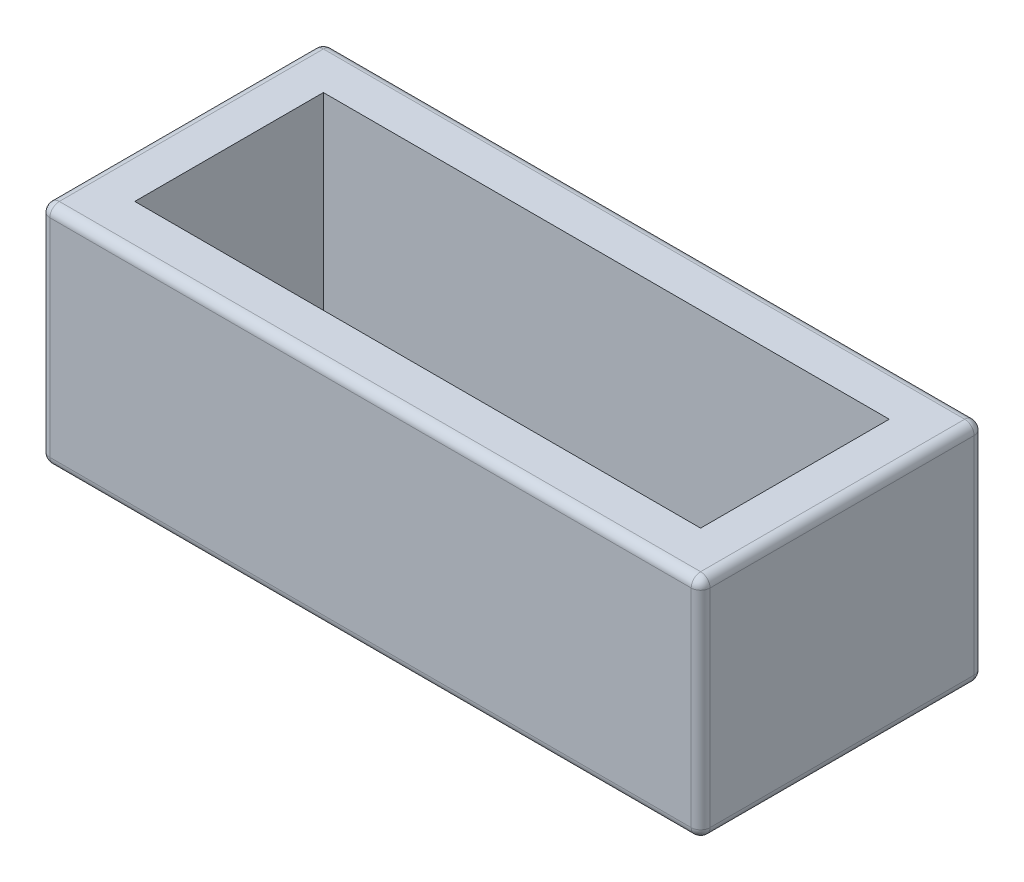
ISO-10303-21;
HEADER;
FILE_DESCRIPTION(('STEP AP214'),'2;1');
FILE_NAME('part.step','',(''),(''),'','','');
FILE_SCHEMA(('AUTOMOTIVE_DESIGN { 1 0 10303 214 1 1 1 1 }'));
ENDSEC;
DATA;
#1=APPLICATION_CONTEXT('core data for automotive mechanical design processes');
#2=APPLICATION_PROTOCOL_DEFINITION('international standard','automotive_design',2000,#1);
#3=PRODUCT_CONTEXT('',#1,'mechanical');
#4=PRODUCT('Part','Part','',(#3));
#5=PRODUCT_RELATED_PRODUCT_CATEGORY('part','',(#4));
#6=PRODUCT_DEFINITION_FORMATION('','',#4);
#7=PRODUCT_DEFINITION_CONTEXT('part definition',#1,'design');
#8=PRODUCT_DEFINITION('design','',#6,#7);
#9=PRODUCT_DEFINITION_SHAPE('','',#8);
#10=(LENGTH_UNIT() NAMED_UNIT(*) SI_UNIT(.MILLI.,.METRE.));
#11=(NAMED_UNIT(*) PLANE_ANGLE_UNIT() SI_UNIT($,.RADIAN.));
#12=(NAMED_UNIT(*) SI_UNIT($,.STERADIAN.) SOLID_ANGLE_UNIT());
#13=UNCERTAINTY_MEASURE_WITH_UNIT(LENGTH_MEASURE(1.E-05),#10,'distance_accuracy_value','');
#14=(GEOMETRIC_REPRESENTATION_CONTEXT(3) GLOBAL_UNCERTAINTY_ASSIGNED_CONTEXT((#13)) GLOBAL_UNIT_ASSIGNED_CONTEXT((#10,
#11,#12)) REPRESENTATION_CONTEXT('',''));
#15=CARTESIAN_POINT('',(0.,0.,0.));
#16=DIRECTION('',(0.,0.,1.));
#17=DIRECTION('',(1.,0.,0.));
#18=AXIS2_PLACEMENT_3D('',#15,#16,#17);
#19=CARTESIAN_POINT('',(0.,12.,0.));
#20=DIRECTION('',(0.,-1.,0.));
#21=DIRECTION('',(0.,0.,-1.));
#22=AXIS2_PLACEMENT_3D('',#19,#20,#21);
#23=PLANE('',#22);
#24=DIRECTION('',(0.,0.,-1.));
#25=VECTOR('',#24,1.);
#26=CARTESIAN_POINT('',(34.5,12.,0.));
#27=LINE('',#26,#25);
#28=CARTESIAN_POINT('',(34.5,12.,-0.5));
#29=VERTEX_POINT('',#28);
#30=CARTESIAN_POINT('',(34.5,12.,-14.5));
#31=VERTEX_POINT('',#30);
#32=EDGE_CURVE('E194',#29,#31,#27,.T.);
#33=ORIENTED_EDGE('',*,*,#32,.T.);
#34=DIRECTION('',(-1.,0.,0.));
#35=VECTOR('',#34,1.);
#36=CARTESIAN_POINT('',(0.,12.,-14.5));
#37=LINE('',#36,#35);
#38=CARTESIAN_POINT('',(0.5,12.,-14.5));
#39=VERTEX_POINT('',#38);
#40=EDGE_CURVE('E198',#31,#39,#37,.T.);
#41=ORIENTED_EDGE('',*,*,#40,.T.);
#42=DIRECTION('',(0.,0.,1.));
#43=VECTOR('',#42,1.);
#44=CARTESIAN_POINT('',(0.5,12.,0.));
#45=LINE('',#44,#43);
#46=CARTESIAN_POINT('',(0.5,12.,-0.5));
#47=VERTEX_POINT('',#46);
#48=EDGE_CURVE('E196',#39,#47,#45,.T.);
#49=ORIENTED_EDGE('',*,*,#48,.T.);
#50=DIRECTION('',(1.,0.,0.));
#51=VECTOR('',#50,1.);
#52=CARTESIAN_POINT('',(0.,12.,-0.5));
#53=LINE('',#52,#51);
#54=EDGE_CURVE('E160',#47,#29,#53,.T.);
#55=ORIENTED_EDGE('',*,*,#54,.T.);
#56=EDGE_LOOP('',(#33,#41,#49,#55));
#57=FACE_BOUND('',#56,.T.);
#58=DIRECTION('',(0.,0.,1.));
#59=VECTOR('',#58,1.);
#60=CARTESIAN_POINT('',(2.5,12.,0.));
#61=LINE('',#60,#59);
#62=CARTESIAN_POINT('',(2.5,12.,-12.5));
#63=VERTEX_POINT('',#62);
#64=CARTESIAN_POINT('',(2.5,12.,-2.5));
#65=VERTEX_POINT('',#64);
#66=EDGE_CURVE('E157',#63,#65,#61,.T.);
#67=ORIENTED_EDGE('',*,*,#66,.F.);
#68=DIRECTION('',(-1.,0.,0.));
#69=VECTOR('',#68,1.);
#70=CARTESIAN_POINT('',(0.,12.,-12.5));
#71=LINE('',#70,#69);
#72=CARTESIAN_POINT('',(32.5,12.,-12.5));
#73=VERTEX_POINT('',#72);
#74=EDGE_CURVE('E183',#73,#63,#71,.T.);
#75=ORIENTED_EDGE('',*,*,#74,.F.);
#76=DIRECTION('',(0.,0.,-1.));
#77=VECTOR('',#76,1.);
#78=CARTESIAN_POINT('',(32.5,12.,0.));
#79=LINE('',#78,#77);
#80=CARTESIAN_POINT('',(32.5,12.,-2.5));
#81=VERTEX_POINT('',#80);
#82=EDGE_CURVE('E189',#81,#73,#79,.T.);
#83=ORIENTED_EDGE('',*,*,#82,.F.);
#84=DIRECTION('',(1.,0.,0.));
#85=VECTOR('',#84,1.);
#86=CARTESIAN_POINT('',(0.,12.,-2.5));
#87=LINE('',#86,#85);
#88=EDGE_CURVE('E187',#65,#81,#87,.T.);
#89=ORIENTED_EDGE('',*,*,#88,.F.);
#90=EDGE_LOOP('',(#67,#75,#83,#89));
#91=FACE_BOUND('',#90,.T.);
#92=ADVANCED_FACE('F37',(#57,#91),#23,.F.);
#93=CARTESIAN_POINT('',(0.,12.,0.));
#94=DIRECTION('',(1.,0.,0.));
#95=DIRECTION('',(0.,0.,-1.));
#96=AXIS2_PLACEMENT_3D('',#93,#94,#95);
#97=PLANE('',#96);
#98=DIRECTION('',(0.,0.,1.));
#99=VECTOR('',#98,1.);
#100=CARTESIAN_POINT('',(0.,11.5,0.));
#101=LINE('',#100,#99);
#102=CARTESIAN_POINT('',(0.,11.5,-0.5));
#103=VERTEX_POINT('',#102);
#104=CARTESIAN_POINT('',(0.,11.5,-14.5));
#105=VERTEX_POINT('',#104);
#106=EDGE_CURVE('E214',#103,#105,#101,.F.);
#107=ORIENTED_EDGE('',*,*,#106,.T.);
#108=DIRECTION('',(0.,-1.,0.));
#109=VECTOR('',#108,1.);
#110=CARTESIAN_POINT('',(0.,12.,-14.5));
#111=LINE('',#110,#109);
#112=CARTESIAN_POINT('',(0.,0.5,-14.5));
#113=VERTEX_POINT('',#112);
#114=EDGE_CURVE('E216',#105,#113,#111,.T.);
#115=ORIENTED_EDGE('',*,*,#114,.T.);
#116=DIRECTION('',(0.,0.,1.));
#117=VECTOR('',#116,1.);
#118=CARTESIAN_POINT('',(0.,0.5,0.));
#119=LINE('',#118,#117);
#120=CARTESIAN_POINT('',(0.,0.5,-0.5));
#121=VERTEX_POINT('',#120);
#122=EDGE_CURVE('E210',#113,#121,#119,.T.);
#123=ORIENTED_EDGE('',*,*,#122,.T.);
#124=DIRECTION('',(0.,-1.,0.));
#125=VECTOR('',#124,1.);
#126=CARTESIAN_POINT('',(0.,12.,-0.5));
#127=LINE('',#126,#125);
#128=EDGE_CURVE('E212',#121,#103,#127,.F.);
#129=ORIENTED_EDGE('',*,*,#128,.T.);
#130=EDGE_LOOP('',(#107,#115,#123,#129));
#131=FACE_BOUND('',#130,.T.);
#132=ADVANCED_FACE('F393',(#131),#97,.F.);
#133=CARTESIAN_POINT('',(0.,12.,0.));
#134=DIRECTION('',(0.,0.,-1.));
#135=DIRECTION('',(-1.,0.,0.));
#136=AXIS2_PLACEMENT_3D('',#133,#134,#135);
#137=PLANE('',#136);
#138=DIRECTION('',(1.,0.,0.));
#139=VECTOR('',#138,1.);
#140=CARTESIAN_POINT('',(0.,11.5,0.));
#141=LINE('',#140,#139);
#142=CARTESIAN_POINT('',(34.5,11.5,0.));
#143=VERTEX_POINT('',#142);
#144=CARTESIAN_POINT('',(0.5,11.5,0.));
#145=VERTEX_POINT('',#144);
#146=EDGE_CURVE('E232',#143,#145,#141,.F.);
#147=ORIENTED_EDGE('',*,*,#146,.T.);
#148=DIRECTION('',(0.,-1.,0.));
#149=VECTOR('',#148,1.);
#150=CARTESIAN_POINT('',(0.5,12.,0.));
#151=LINE('',#150,#149);
#152=CARTESIAN_POINT('',(0.5,0.5,0.));
#153=VERTEX_POINT('',#152);
#154=EDGE_CURVE('E234',#145,#153,#151,.T.);
#155=ORIENTED_EDGE('',*,*,#154,.T.);
#156=DIRECTION('',(1.,0.,0.));
#157=VECTOR('',#156,1.);
#158=CARTESIAN_POINT('',(35.,0.5,0.));
#159=LINE('',#158,#157);
#160=CARTESIAN_POINT('',(34.5,0.5,0.));
#161=VERTEX_POINT('',#160);
#162=EDGE_CURVE('E228',#153,#161,#159,.T.);
#163=ORIENTED_EDGE('',*,*,#162,.T.);
#164=DIRECTION('',(0.,-1.,0.));
#165=VECTOR('',#164,1.);
#166=CARTESIAN_POINT('',(34.5,12.,0.));
#167=LINE('',#166,#165);
#168=EDGE_CURVE('E230',#161,#143,#167,.F.);
#169=ORIENTED_EDGE('',*,*,#168,.T.);
#170=EDGE_LOOP('',(#147,#155,#163,#169));
#171=FACE_BOUND('',#170,.T.);
#172=ADVANCED_FACE('F331',(#171),#137,.F.);
#173=CARTESIAN_POINT('',(35.,12.,0.));
#174=DIRECTION('',(-1.,0.,0.));
#175=DIRECTION('',(0.,0.,1.));
#176=AXIS2_PLACEMENT_3D('',#173,#174,#175);
#177=PLANE('',#176);
#178=DIRECTION('',(0.,-1.,0.));
#179=VECTOR('',#178,1.);
#180=CARTESIAN_POINT('',(35.,12.,-14.5));
#181=LINE('',#180,#179);
#182=CARTESIAN_POINT('',(35.,0.5,-14.5));
#183=VERTEX_POINT('',#182);
#184=CARTESIAN_POINT('',(35.,11.5,-14.5));
#185=VERTEX_POINT('',#184);
#186=EDGE_CURVE('E223',#183,#185,#181,.F.);
#187=ORIENTED_EDGE('',*,*,#186,.T.);
#188=DIRECTION('',(0.,0.,-1.));
#189=VECTOR('',#188,1.);
#190=CARTESIAN_POINT('',(35.,11.5,0.));
#191=LINE('',#190,#189);
#192=CARTESIAN_POINT('',(35.,11.5,-0.5));
#193=VERTEX_POINT('',#192);
#194=EDGE_CURVE('E225',#185,#193,#191,.F.);
#195=ORIENTED_EDGE('',*,*,#194,.T.);
#196=DIRECTION('',(0.,-1.,0.));
#197=VECTOR('',#196,1.);
#198=CARTESIAN_POINT('',(35.,12.,-0.5));
#199=LINE('',#198,#197);
#200=CARTESIAN_POINT('',(35.,0.5,-0.5));
#201=VERTEX_POINT('',#200);
#202=EDGE_CURVE('E221',#193,#201,#199,.T.);
#203=ORIENTED_EDGE('',*,*,#202,.T.);
#204=DIRECTION('',(0.,0.,-1.));
#205=VECTOR('',#204,1.);
#206=CARTESIAN_POINT('',(35.,0.5,-15.));
#207=LINE('',#206,#205);
#208=EDGE_CURVE('E219',#201,#183,#207,.T.);
#209=ORIENTED_EDGE('',*,*,#208,.T.);
#210=EDGE_LOOP('',(#187,#195,#203,#209));
#211=FACE_BOUND('',#210,.T.);
#212=ADVANCED_FACE('F322',(#211),#177,.F.);
#213=CARTESIAN_POINT('',(0.,12.,-15.));
#214=DIRECTION('',(0.,0.,1.));
#215=DIRECTION('',(1.,0.,0.));
#216=AXIS2_PLACEMENT_3D('',#213,#214,#215);
#217=PLANE('',#216);
#218=DIRECTION('',(0.,-1.,0.));
#219=VECTOR('',#218,1.);
#220=CARTESIAN_POINT('',(0.5,12.,-15.));
#221=LINE('',#220,#219);
#222=CARTESIAN_POINT('',(0.5,0.5,-15.));
#223=VERTEX_POINT('',#222);
#224=CARTESIAN_POINT('',(0.5,11.5,-15.));
#225=VERTEX_POINT('',#224);
#226=EDGE_CURVE('E205',#223,#225,#221,.F.);
#227=ORIENTED_EDGE('',*,*,#226,.T.);
#228=DIRECTION('',(-1.,0.,0.));
#229=VECTOR('',#228,1.);
#230=CARTESIAN_POINT('',(0.,11.5,-15.));
#231=LINE('',#230,#229);
#232=CARTESIAN_POINT('',(34.5,11.5,-15.));
#233=VERTEX_POINT('',#232);
#234=EDGE_CURVE('E207',#225,#233,#231,.F.);
#235=ORIENTED_EDGE('',*,*,#234,.T.);
#236=DIRECTION('',(0.,-1.,0.));
#237=VECTOR('',#236,1.);
#238=CARTESIAN_POINT('',(34.5,12.,-15.));
#239=LINE('',#238,#237);
#240=CARTESIAN_POINT('',(34.5,0.5,-15.));
#241=VERTEX_POINT('',#240);
#242=EDGE_CURVE('E203',#233,#241,#239,.T.);
#243=ORIENTED_EDGE('',*,*,#242,.T.);
#244=DIRECTION('',(-1.,0.,0.));
#245=VECTOR('',#244,1.);
#246=CARTESIAN_POINT('',(0.,0.5,-15.));
#247=LINE('',#246,#245);
#248=EDGE_CURVE('E201',#241,#223,#247,.T.);
#249=ORIENTED_EDGE('',*,*,#248,.T.);
#250=EDGE_LOOP('',(#227,#235,#243,#249));
#251=FACE_BOUND('',#250,.T.);
#252=ADVANCED_FACE('F367',(#251),#217,.F.);
#253=CARTESIAN_POINT('',(0.,0.,0.));
#254=DIRECTION('',(0.,-1.,0.));
#255=DIRECTION('',(0.,0.,-1.));
#256=AXIS2_PLACEMENT_3D('',#253,#254,#255);
#257=PLANE('',#256);
#258=DIRECTION('',(0.,0.,-1.));
#259=VECTOR('',#258,1.);
#260=CARTESIAN_POINT('',(34.5,0.,0.));
#261=LINE('',#260,#259);
#262=CARTESIAN_POINT('',(34.5,0.,-14.5));
#263=VERTEX_POINT('',#262);
#264=CARTESIAN_POINT('',(34.5,0.,-0.5));
#265=VERTEX_POINT('',#264);
#266=EDGE_CURVE('E46',#263,#265,#261,.F.);
#267=ORIENTED_EDGE('',*,*,#266,.T.);
#268=DIRECTION('',(1.,0.,0.));
#269=VECTOR('',#268,1.);
#270=CARTESIAN_POINT('',(0.,0.,-0.5));
#271=LINE('',#270,#269);
#272=CARTESIAN_POINT('',(0.5,0.,-0.5));
#273=VERTEX_POINT('',#272);
#274=EDGE_CURVE('E11',#265,#273,#271,.F.);
#275=ORIENTED_EDGE('',*,*,#274,.T.);
#276=DIRECTION('',(0.,0.,1.));
#277=VECTOR('',#276,1.);
#278=CARTESIAN_POINT('',(0.5,0.,-15.));
#279=LINE('',#278,#277);
#280=CARTESIAN_POINT('',(0.5,0.,-14.5));
#281=VERTEX_POINT('',#280);
#282=EDGE_CURVE('E237',#273,#281,#279,.F.);
#283=ORIENTED_EDGE('',*,*,#282,.T.);
#284=DIRECTION('',(-1.,0.,0.));
#285=VECTOR('',#284,1.);
#286=CARTESIAN_POINT('',(35.,0.,-14.5));
#287=LINE('',#286,#285);
#288=EDGE_CURVE('E57',#281,#263,#287,.F.);
#289=ORIENTED_EDGE('',*,*,#288,.T.);
#290=EDGE_LOOP('',(#267,#275,#283,#289));
#291=FACE_BOUND('',#290,.T.);
#292=ADVANCED_FACE('F350',(#291),#257,.T.);
#293=CARTESIAN_POINT('',(2.5,12.,0.));
#294=DIRECTION('',(1.,0.,0.));
#295=DIRECTION('',(0.,0.,-1.));
#296=AXIS2_PLACEMENT_3D('',#293,#294,#295);
#297=PLANE('',#296);
#298=DIRECTION('',(0.,-1.,0.));
#299=VECTOR('',#298,1.);
#300=CARTESIAN_POINT('',(2.5,12.,-2.5));
#301=LINE('',#300,#299);
#302=CARTESIAN_POINT('',(2.5,2.,-2.5));
#303=VERTEX_POINT('',#302);
#304=EDGE_CURVE('E149',#65,#303,#301,.T.);
#305=ORIENTED_EDGE('',*,*,#304,.T.);
#306=DIRECTION('',(0.,0.,1.));
#307=VECTOR('',#306,1.);
#308=CARTESIAN_POINT('',(2.5,2.,-2.5));
#309=LINE('',#308,#307);
#310=CARTESIAN_POINT('',(2.5,2.,-12.5));
#311=VERTEX_POINT('',#310);
#312=EDGE_CURVE('E154',#311,#303,#309,.T.);
#313=ORIENTED_EDGE('',*,*,#312,.F.);
#314=DIRECTION('',(0.,-1.,0.));
#315=VECTOR('',#314,1.);
#316=CARTESIAN_POINT('',(2.5,12.,-12.5));
#317=LINE('',#316,#315);
#318=EDGE_CURVE('E180',#63,#311,#317,.T.);
#319=ORIENTED_EDGE('',*,*,#318,.F.);
#320=ORIENTED_EDGE('',*,*,#66,.T.);
#321=EDGE_LOOP('',(#305,#313,#319,#320));
#322=FACE_BOUND('',#321,.T.);
#323=ADVANCED_FACE('F151',(#322),#297,.T.);
#324=CARTESIAN_POINT('',(0.,12.,-2.5));
#325=DIRECTION('',(0.,0.,-1.));
#326=DIRECTION('',(-1.,0.,0.));
#327=AXIS2_PLACEMENT_3D('',#324,#325,#326);
#328=PLANE('',#327);
#329=DIRECTION('',(0.,-1.,0.));
#330=VECTOR('',#329,1.);
#331=CARTESIAN_POINT('',(32.5,12.,-2.5));
#332=LINE('',#331,#330);
#333=CARTESIAN_POINT('',(32.5,2.,-2.5));
#334=VERTEX_POINT('',#333);
#335=EDGE_CURVE('E161',#81,#334,#332,.T.);
#336=ORIENTED_EDGE('',*,*,#335,.T.);
#337=DIRECTION('',(1.,0.,0.));
#338=VECTOR('',#337,1.);
#339=CARTESIAN_POINT('',(2.5,2.,-2.5));
#340=LINE('',#339,#338);
#341=EDGE_CURVE('E164',#303,#334,#340,.T.);
#342=ORIENTED_EDGE('',*,*,#341,.F.);
#343=ORIENTED_EDGE('',*,*,#304,.F.);
#344=ORIENTED_EDGE('',*,*,#88,.T.);
#345=EDGE_LOOP('',(#336,#342,#343,#344));
#346=FACE_BOUND('',#345,.T.);
#347=ADVANCED_FACE('F165',(#346),#328,.T.);
#348=CARTESIAN_POINT('',(32.5,12.,0.));
#349=DIRECTION('',(-1.,0.,0.));
#350=DIRECTION('',(0.,0.,1.));
#351=AXIS2_PLACEMENT_3D('',#348,#349,#350);
#352=PLANE('',#351);
#353=DIRECTION('',(0.,-1.,0.));
#354=VECTOR('',#353,1.);
#355=CARTESIAN_POINT('',(32.5,12.,-12.5));
#356=LINE('',#355,#354);
#357=CARTESIAN_POINT('',(32.5,2.,-12.5));
#358=VERTEX_POINT('',#357);
#359=EDGE_CURVE('E182',#73,#358,#356,.T.);
#360=ORIENTED_EDGE('',*,*,#359,.T.);
#361=DIRECTION('',(0.,0.,-1.));
#362=VECTOR('',#361,1.);
#363=CARTESIAN_POINT('',(32.5,2.,-2.5));
#364=LINE('',#363,#362);
#365=EDGE_CURVE('E170',#334,#358,#364,.T.);
#366=ORIENTED_EDGE('',*,*,#365,.F.);
#367=ORIENTED_EDGE('',*,*,#335,.F.);
#368=ORIENTED_EDGE('',*,*,#82,.T.);
#369=EDGE_LOOP('',(#360,#366,#367,#368));
#370=FACE_BOUND('',#369,.T.);
#371=ADVANCED_FACE('F615',(#370),#352,.T.);
#372=CARTESIAN_POINT('',(0.,12.,-12.5));
#373=DIRECTION('',(0.,0.,1.));
#374=DIRECTION('',(1.,0.,0.));
#375=AXIS2_PLACEMENT_3D('',#372,#373,#374);
#376=PLANE('',#375);
#377=ORIENTED_EDGE('',*,*,#318,.T.);
#378=DIRECTION('',(-1.,0.,0.));
#379=VECTOR('',#378,1.);
#380=CARTESIAN_POINT('',(2.5,2.,-12.5));
#381=LINE('',#380,#379);
#382=EDGE_CURVE('E174',#358,#311,#381,.T.);
#383=ORIENTED_EDGE('',*,*,#382,.F.);
#384=ORIENTED_EDGE('',*,*,#359,.F.);
#385=ORIENTED_EDGE('',*,*,#74,.T.);
#386=EDGE_LOOP('',(#377,#383,#384,#385));
#387=FACE_BOUND('',#386,.T.);
#388=ADVANCED_FACE('F404',(#387),#376,.T.);
#389=CARTESIAN_POINT('',(0.,0.5,-0.5));
#390=DIRECTION('',(-1.,0.,0.));
#391=DIRECTION('',(0.,0.,1.));
#392=AXIS2_PLACEMENT_3D('',#389,#390,#391);
#393=CYLINDRICAL_SURFACE('',#392,0.5);
#394=CARTESIAN_POINT('',(34.5,0.5,-0.5));
#395=DIRECTION('',(1.,0.,0.));
#396=DIRECTION('',(0.,0.,-1.));
#397=AXIS2_PLACEMENT_3D('',#394,#395,#396);
#398=CIRCLE('',#397,0.5);
#399=EDGE_CURVE('E41',#161,#265,#398,.T.);
#400=ORIENTED_EDGE('',*,*,#399,.F.);
#401=ORIENTED_EDGE('',*,*,#162,.F.);
#402=CARTESIAN_POINT('',(0.5,0.5,-0.5));
#403=DIRECTION('',(-1.,0.,0.));
#404=DIRECTION('',(0.,0.,1.));
#405=AXIS2_PLACEMENT_3D('',#402,#403,#404);
#406=CIRCLE('',#405,0.5);
#407=EDGE_CURVE('E300',#273,#153,#406,.T.);
#408=ORIENTED_EDGE('',*,*,#407,.F.);
#409=ORIENTED_EDGE('',*,*,#274,.F.);
#410=EDGE_LOOP('',(#400,#401,#408,#409));
#411=FACE_BOUND('',#410,.T.);
#412=ADVANCED_FACE('F39',(#411),#393,.T.);
#413=CARTESIAN_POINT('',(34.5,0.5,-0.5));
#414=DIRECTION('',(0.,0.,1.));
#415=DIRECTION('',(1.,0.,0.));
#416=AXIS2_PLACEMENT_3D('',#413,#414,#415);
#417=SPHERICAL_SURFACE('',#416,0.5);
#418=CARTESIAN_POINT('',(34.5,0.5,-0.5));
#419=DIRECTION('',(0.,-1.,0.));
#420=DIRECTION('',(0.,0.,-1.));
#421=AXIS2_PLACEMENT_3D('',#418,#419,#420);
#422=CIRCLE('',#421,0.5);
#423=EDGE_CURVE('E295',#161,#201,#422,.F.);
#424=ORIENTED_EDGE('',*,*,#423,.F.);
#425=ORIENTED_EDGE('',*,*,#399,.T.);
#426=CARTESIAN_POINT('',(34.5,0.5,-0.5));
#427=DIRECTION('',(0.,0.,1.));
#428=DIRECTION('',(1.,0.,0.));
#429=AXIS2_PLACEMENT_3D('',#426,#427,#428);
#430=CIRCLE('',#429,0.5);
#431=EDGE_CURVE('E298',#201,#265,#430,.F.);
#432=ORIENTED_EDGE('',*,*,#431,.F.);
#433=EDGE_LOOP('',(#424,#425,#432));
#434=FACE_BOUND('',#433,.T.);
#435=ADVANCED_FACE('F312',(#434),#417,.T.);
#436=CARTESIAN_POINT('',(0.5,0.5,-0.5));
#437=DIRECTION('',(0.,0.,1.));
#438=DIRECTION('',(1.,0.,0.));
#439=AXIS2_PLACEMENT_3D('',#436,#437,#438);
#440=SPHERICAL_SURFACE('',#439,0.5);
#441=CARTESIAN_POINT('',(0.5,0.5,-0.5));
#442=DIRECTION('',(0.,0.,1.));
#443=DIRECTION('',(1.,0.,0.));
#444=AXIS2_PLACEMENT_3D('',#441,#442,#443);
#445=CIRCLE('',#444,0.5);
#446=EDGE_CURVE('E290',#273,#121,#445,.F.);
#447=ORIENTED_EDGE('',*,*,#446,.F.);
#448=ORIENTED_EDGE('',*,*,#407,.T.);
#449=CARTESIAN_POINT('',(0.5,0.5,-0.5));
#450=DIRECTION('',(0.,-1.,0.));
#451=DIRECTION('',(0.,0.,-1.));
#452=AXIS2_PLACEMENT_3D('',#449,#450,#451);
#453=CIRCLE('',#452,0.5);
#454=EDGE_CURVE('E293',#121,#153,#453,.F.);
#455=ORIENTED_EDGE('',*,*,#454,.F.);
#456=EDGE_LOOP('',(#447,#448,#455));
#457=FACE_BOUND('',#456,.T.);
#458=ADVANCED_FACE('F347',(#457),#440,.T.);
#459=CARTESIAN_POINT('',(34.5,0.5,0.));
#460=DIRECTION('',(0.,0.,1.));
#461=DIRECTION('',(1.,0.,0.));
#462=AXIS2_PLACEMENT_3D('',#459,#460,#461);
#463=CYLINDRICAL_SURFACE('',#462,0.5);
#464=ORIENTED_EDGE('',*,*,#431,.T.);
#465=ORIENTED_EDGE('',*,*,#266,.F.);
#466=CARTESIAN_POINT('',(34.5,0.5,-14.5));
#467=DIRECTION('',(0.,0.,-1.));
#468=DIRECTION('',(-1.,0.,0.));
#469=AXIS2_PLACEMENT_3D('',#466,#467,#468);
#470=CIRCLE('',#469,0.5);
#471=EDGE_CURVE('E284',#183,#263,#470,.T.);
#472=ORIENTED_EDGE('',*,*,#471,.F.);
#473=ORIENTED_EDGE('',*,*,#208,.F.);
#474=EDGE_LOOP('',(#464,#465,#472,#473));
#475=FACE_BOUND('',#474,.T.);
#476=ADVANCED_FACE('F317',(#475),#463,.T.);
#477=CARTESIAN_POINT('',(34.5,12.,-0.5));
#478=DIRECTION('',(0.,-1.,0.));
#479=DIRECTION('',(0.,0.,-1.));
#480=AXIS2_PLACEMENT_3D('',#477,#478,#479);
#481=CYLINDRICAL_SURFACE('',#480,0.5);
#482=ORIENTED_EDGE('',*,*,#423,.T.);
#483=ORIENTED_EDGE('',*,*,#202,.F.);
#484=CARTESIAN_POINT('',(34.5,11.5,-0.5));
#485=DIRECTION('',(0.,1.,0.));
#486=DIRECTION('',(0.,0.,1.));
#487=AXIS2_PLACEMENT_3D('',#484,#485,#486);
#488=CIRCLE('',#487,0.5);
#489=EDGE_CURVE('E281',#143,#193,#488,.T.);
#490=ORIENTED_EDGE('',*,*,#489,.F.);
#491=ORIENTED_EDGE('',*,*,#168,.F.);
#492=EDGE_LOOP('',(#482,#483,#490,#491));
#493=FACE_BOUND('',#492,.T.);
#494=ADVANCED_FACE('F328',(#493),#481,.T.);
#495=CARTESIAN_POINT('',(0.,11.5,-0.5));
#496=DIRECTION('',(1.,0.,0.));
#497=DIRECTION('',(0.,0.,-1.));
#498=AXIS2_PLACEMENT_3D('',#495,#496,#497);
#499=CYLINDRICAL_SURFACE('',#498,0.5);
#500=CARTESIAN_POINT('',(0.5,11.5,-0.5));
#501=DIRECTION('',(-1.,0.,0.));
#502=DIRECTION('',(0.,0.,1.));
#503=AXIS2_PLACEMENT_3D('',#500,#501,#502);
#504=CIRCLE('',#503,0.5);
#505=EDGE_CURVE('E275',#145,#47,#504,.T.);
#506=ORIENTED_EDGE('',*,*,#505,.F.);
#507=ORIENTED_EDGE('',*,*,#146,.F.);
#508=CARTESIAN_POINT('',(34.5,11.5,-0.5));
#509=DIRECTION('',(1.,0.,0.));
#510=DIRECTION('',(0.,0.,-1.));
#511=AXIS2_PLACEMENT_3D('',#508,#509,#510);
#512=CIRCLE('',#511,0.5);
#513=EDGE_CURVE('E278',#29,#143,#512,.T.);
#514=ORIENTED_EDGE('',*,*,#513,.F.);
#515=ORIENTED_EDGE('',*,*,#54,.F.);
#516=EDGE_LOOP('',(#506,#507,#514,#515));
#517=FACE_BOUND('',#516,.T.);
#518=ADVANCED_FACE('F336',(#517),#499,.T.);
#519=CARTESIAN_POINT('',(0.5,12.,-0.5));
#520=DIRECTION('',(0.,-1.,0.));
#521=DIRECTION('',(0.,0.,-1.));
#522=AXIS2_PLACEMENT_3D('',#519,#520,#521);
#523=CYLINDRICAL_SURFACE('',#522,0.5);
#524=ORIENTED_EDGE('',*,*,#454,.T.);
#525=ORIENTED_EDGE('',*,*,#154,.F.);
#526=CARTESIAN_POINT('',(0.5,11.5,-0.5));
#527=DIRECTION('',(0.,1.,0.));
#528=DIRECTION('',(0.,0.,1.));
#529=AXIS2_PLACEMENT_3D('',#526,#527,#528);
#530=CIRCLE('',#529,0.5);
#531=EDGE_CURVE('E272',#103,#145,#530,.T.);
#532=ORIENTED_EDGE('',*,*,#531,.F.);
#533=ORIENTED_EDGE('',*,*,#128,.F.);
#534=EDGE_LOOP('',(#524,#525,#532,#533));
#535=FACE_BOUND('',#534,.T.);
#536=ADVANCED_FACE('F346',(#535),#523,.T.);
#537=CARTESIAN_POINT('',(0.5,0.5,0.));
#538=DIRECTION('',(0.,0.,-1.));
#539=DIRECTION('',(-1.,0.,0.));
#540=AXIS2_PLACEMENT_3D('',#537,#538,#539);
#541=CYLINDRICAL_SURFACE('',#540,0.5);
#542=ORIENTED_EDGE('',*,*,#446,.T.);
#543=ORIENTED_EDGE('',*,*,#122,.F.);
#544=CARTESIAN_POINT('',(0.5,0.5,-14.5));
#545=DIRECTION('',(0.,0.,-1.));
#546=DIRECTION('',(-1.,0.,0.));
#547=AXIS2_PLACEMENT_3D('',#544,#545,#546);
#548=CIRCLE('',#547,0.5);
#549=EDGE_CURVE('E269',#281,#113,#548,.T.);
#550=ORIENTED_EDGE('',*,*,#549,.F.);
#551=ORIENTED_EDGE('',*,*,#282,.F.);
#552=EDGE_LOOP('',(#542,#543,#550,#551));
#553=FACE_BOUND('',#552,.T.);
#554=ADVANCED_FACE('F357',(#553),#541,.T.);
#555=CARTESIAN_POINT('',(0.,0.5,-14.5));
#556=DIRECTION('',(1.,0.,0.));
#557=DIRECTION('',(0.,0.,-1.));
#558=AXIS2_PLACEMENT_3D('',#555,#556,#557);
#559=CYLINDRICAL_SURFACE('',#558,0.5);
#560=CARTESIAN_POINT('',(34.5,0.5,-14.5));
#561=DIRECTION('',(1.,0.,0.));
#562=DIRECTION('',(0.,0.,-1.));
#563=AXIS2_PLACEMENT_3D('',#560,#561,#562);
#564=CIRCLE('',#563,0.5);
#565=EDGE_CURVE('E287',#263,#241,#564,.T.);
#566=ORIENTED_EDGE('',*,*,#565,.F.);
#567=ORIENTED_EDGE('',*,*,#288,.F.);
#568=CARTESIAN_POINT('',(0.5,0.5,-14.5));
#569=DIRECTION('',(-1.,0.,0.));
#570=DIRECTION('',(0.,0.,1.));
#571=AXIS2_PLACEMENT_3D('',#568,#569,#570);
#572=CIRCLE('',#571,0.5);
#573=EDGE_CURVE('E266',#223,#281,#572,.T.);
#574=ORIENTED_EDGE('',*,*,#573,.F.);
#575=ORIENTED_EDGE('',*,*,#248,.F.);
#576=EDGE_LOOP('',(#566,#567,#574,#575));
#577=FACE_BOUND('',#576,.T.);
#578=ADVANCED_FACE('F354',(#577),#559,.T.);
#579=CARTESIAN_POINT('',(34.5,0.5,-14.5));
#580=DIRECTION('',(0.,0.,1.));
#581=DIRECTION('',(1.,0.,0.));
#582=AXIS2_PLACEMENT_3D('',#579,#580,#581);
#583=SPHERICAL_SURFACE('',#582,0.5);
#584=ORIENTED_EDGE('',*,*,#471,.T.);
#585=ORIENTED_EDGE('',*,*,#565,.T.);
#586=CARTESIAN_POINT('',(34.5,0.5,-14.5));
#587=DIRECTION('',(0.,-1.,0.));
#588=DIRECTION('',(0.,0.,-1.));
#589=AXIS2_PLACEMENT_3D('',#586,#587,#588);
#590=CIRCLE('',#589,0.5);
#591=EDGE_CURVE('E263',#183,#241,#590,.F.);
#592=ORIENTED_EDGE('',*,*,#591,.F.);
#593=EDGE_LOOP('',(#584,#585,#592));
#594=FACE_BOUND('',#593,.T.);
#595=ADVANCED_FACE('F370',(#594),#583,.T.);
#596=CARTESIAN_POINT('',(34.5,11.5,-0.5));
#597=DIRECTION('',(0.,0.,1.));
#598=DIRECTION('',(1.,0.,0.));
#599=AXIS2_PLACEMENT_3D('',#596,#597,#598);
#600=SPHERICAL_SURFACE('',#599,0.5);
#601=ORIENTED_EDGE('',*,*,#513,.T.);
#602=ORIENTED_EDGE('',*,*,#489,.T.);
#603=CARTESIAN_POINT('',(34.5,11.5,-0.5));
#604=DIRECTION('',(0.,0.,1.));
#605=DIRECTION('',(1.,0.,0.));
#606=AXIS2_PLACEMENT_3D('',#603,#604,#605);
#607=CIRCLE('',#606,0.5);
#608=EDGE_CURVE('E261',#29,#193,#607,.F.);
#609=ORIENTED_EDGE('',*,*,#608,.F.);
#610=EDGE_LOOP('',(#601,#602,#609));
#611=FACE_BOUND('',#610,.T.);
#612=ADVANCED_FACE('F383',(#611),#600,.T.);
#613=CARTESIAN_POINT('',(0.5,11.5,-0.5));
#614=DIRECTION('',(0.,0.,1.));
#615=DIRECTION('',(1.,0.,0.));
#616=AXIS2_PLACEMENT_3D('',#613,#614,#615);
#617=SPHERICAL_SURFACE('',#616,0.5);
#618=ORIENTED_EDGE('',*,*,#531,.T.);
#619=ORIENTED_EDGE('',*,*,#505,.T.);
#620=CARTESIAN_POINT('',(0.5,11.5,-0.5));
#621=DIRECTION('',(0.,0.,1.));
#622=DIRECTION('',(1.,0.,0.));
#623=AXIS2_PLACEMENT_3D('',#620,#621,#622);
#624=CIRCLE('',#623,0.5);
#625=EDGE_CURVE('E258',#103,#47,#624,.F.);
#626=ORIENTED_EDGE('',*,*,#625,.F.);
#627=EDGE_LOOP('',(#618,#619,#626));
#628=FACE_BOUND('',#627,.T.);
#629=ADVANCED_FACE('F342',(#628),#617,.T.);
#630=CARTESIAN_POINT('',(0.5,0.5,-14.5));
#631=DIRECTION('',(0.,0.,1.));
#632=DIRECTION('',(1.,0.,0.));
#633=AXIS2_PLACEMENT_3D('',#630,#631,#632);
#634=SPHERICAL_SURFACE('',#633,0.5);
#635=ORIENTED_EDGE('',*,*,#573,.T.);
#636=ORIENTED_EDGE('',*,*,#549,.T.);
#637=CARTESIAN_POINT('',(0.5,0.5,-14.5));
#638=DIRECTION('',(0.,-1.,0.));
#639=DIRECTION('',(0.,0.,-1.));
#640=AXIS2_PLACEMENT_3D('',#637,#638,#639);
#641=CIRCLE('',#640,0.5);
#642=EDGE_CURVE('E256',#223,#113,#641,.F.);
#643=ORIENTED_EDGE('',*,*,#642,.F.);
#644=EDGE_LOOP('',(#635,#636,#643));
#645=FACE_BOUND('',#644,.T.);
#646=ADVANCED_FACE('F359',(#645),#634,.T.);
#647=CARTESIAN_POINT('',(34.5,12.,-14.5));
#648=DIRECTION('',(0.,-1.,0.));
#649=DIRECTION('',(0.,0.,-1.));
#650=AXIS2_PLACEMENT_3D('',#647,#648,#649);
#651=CYLINDRICAL_SURFACE('',#650,0.5);
#652=ORIENTED_EDGE('',*,*,#591,.T.);
#653=ORIENTED_EDGE('',*,*,#242,.F.);
#654=CARTESIAN_POINT('',(34.5,11.5,-14.5));
#655=DIRECTION('',(0.,1.,0.));
#656=DIRECTION('',(0.,0.,1.));
#657=AXIS2_PLACEMENT_3D('',#654,#655,#656);
#658=CIRCLE('',#657,0.5);
#659=EDGE_CURVE('E253',#185,#233,#658,.T.);
#660=ORIENTED_EDGE('',*,*,#659,.F.);
#661=ORIENTED_EDGE('',*,*,#186,.F.);
#662=EDGE_LOOP('',(#652,#653,#660,#661));
#663=FACE_BOUND('',#662,.T.);
#664=ADVANCED_FACE('F372',(#663),#651,.T.);
#665=CARTESIAN_POINT('',(34.5,11.5,0.));
#666=DIRECTION('',(0.,0.,-1.));
#667=DIRECTION('',(-1.,0.,0.));
#668=AXIS2_PLACEMENT_3D('',#665,#666,#667);
#669=CYLINDRICAL_SURFACE('',#668,0.5);
#670=ORIENTED_EDGE('',*,*,#608,.T.);
#671=ORIENTED_EDGE('',*,*,#194,.F.);
#672=CARTESIAN_POINT('',(34.5,11.5,-14.5));
#673=DIRECTION('',(0.,0.,-1.));
#674=DIRECTION('',(-1.,0.,0.));
#675=AXIS2_PLACEMENT_3D('',#672,#673,#674);
#676=CIRCLE('',#675,0.5);
#677=EDGE_CURVE('E250',#31,#185,#676,.T.);
#678=ORIENTED_EDGE('',*,*,#677,.F.);
#679=ORIENTED_EDGE('',*,*,#32,.F.);
#680=EDGE_LOOP('',(#670,#671,#678,#679));
#681=FACE_BOUND('',#680,.T.);
#682=ADVANCED_FACE('F381',(#681),#669,.T.);
#683=CARTESIAN_POINT('',(0.5,11.5,0.));
#684=DIRECTION('',(0.,0.,1.));
#685=DIRECTION('',(1.,0.,0.));
#686=AXIS2_PLACEMENT_3D('',#683,#684,#685);
#687=CYLINDRICAL_SURFACE('',#686,0.5);
#688=ORIENTED_EDGE('',*,*,#625,.T.);
#689=ORIENTED_EDGE('',*,*,#48,.F.);
#690=CARTESIAN_POINT('',(0.5,11.5,-14.5));
#691=DIRECTION('',(0.,0.,-1.));
#692=DIRECTION('',(-1.,0.,0.));
#693=AXIS2_PLACEMENT_3D('',#690,#691,#692);
#694=CIRCLE('',#693,0.5);
#695=EDGE_CURVE('E247',#105,#39,#694,.T.);
#696=ORIENTED_EDGE('',*,*,#695,.F.);
#697=ORIENTED_EDGE('',*,*,#106,.F.);
#698=EDGE_LOOP('',(#688,#689,#696,#697));
#699=FACE_BOUND('',#698,.T.);
#700=ADVANCED_FACE('F426',(#699),#687,.T.);
#701=CARTESIAN_POINT('',(0.5,12.,-14.5));
#702=DIRECTION('',(0.,-1.,0.));
#703=DIRECTION('',(0.,0.,-1.));
#704=AXIS2_PLACEMENT_3D('',#701,#702,#703);
#705=CYLINDRICAL_SURFACE('',#704,0.5);
#706=ORIENTED_EDGE('',*,*,#642,.T.);
#707=ORIENTED_EDGE('',*,*,#114,.F.);
#708=CARTESIAN_POINT('',(0.5,11.5,-14.5));
#709=DIRECTION('',(0.,1.,0.));
#710=DIRECTION('',(0.,0.,1.));
#711=AXIS2_PLACEMENT_3D('',#708,#709,#710);
#712=CIRCLE('',#711,0.5);
#713=EDGE_CURVE('E244',#225,#105,#712,.T.);
#714=ORIENTED_EDGE('',*,*,#713,.F.);
#715=ORIENTED_EDGE('',*,*,#226,.F.);
#716=EDGE_LOOP('',(#706,#707,#714,#715));
#717=FACE_BOUND('',#716,.T.);
#718=ADVANCED_FACE('F364',(#717),#705,.T.);
#719=CARTESIAN_POINT('',(34.5,11.5,-14.5));
#720=DIRECTION('',(0.,0.,1.));
#721=DIRECTION('',(1.,0.,0.));
#722=AXIS2_PLACEMENT_3D('',#719,#720,#721);
#723=SPHERICAL_SURFACE('',#722,0.5);
#724=ORIENTED_EDGE('',*,*,#677,.T.);
#725=ORIENTED_EDGE('',*,*,#659,.T.);
#726=CARTESIAN_POINT('',(34.5,11.5,-14.5));
#727=DIRECTION('',(1.,0.,0.));
#728=DIRECTION('',(0.,0.,-1.));
#729=AXIS2_PLACEMENT_3D('',#726,#727,#728);
#730=CIRCLE('',#729,0.5);
#731=EDGE_CURVE('E242',#31,#233,#730,.F.);
#732=ORIENTED_EDGE('',*,*,#731,.F.);
#733=EDGE_LOOP('',(#724,#725,#732));
#734=FACE_BOUND('',#733,.T.);
#735=ADVANCED_FACE('F377',(#734),#723,.T.);
#736=CARTESIAN_POINT('',(0.5,11.5,-14.5));
#737=DIRECTION('',(0.,0.,1.));
#738=DIRECTION('',(1.,0.,0.));
#739=AXIS2_PLACEMENT_3D('',#736,#737,#738);
#740=SPHERICAL_SURFACE('',#739,0.5);
#741=ORIENTED_EDGE('',*,*,#713,.T.);
#742=ORIENTED_EDGE('',*,*,#695,.T.);
#743=CARTESIAN_POINT('',(0.5,11.5,-14.5));
#744=DIRECTION('',(-1.,0.,0.));
#745=DIRECTION('',(0.,0.,1.));
#746=AXIS2_PLACEMENT_3D('',#743,#744,#745);
#747=CIRCLE('',#746,0.5);
#748=EDGE_CURVE('E178',#225,#39,#747,.F.);
#749=ORIENTED_EDGE('',*,*,#748,.F.);
#750=EDGE_LOOP('',(#741,#742,#749));
#751=FACE_BOUND('',#750,.T.);
#752=ADVANCED_FACE('F417',(#751),#740,.T.);
#753=CARTESIAN_POINT('',(0.,11.5,-14.5));
#754=DIRECTION('',(-1.,0.,0.));
#755=DIRECTION('',(0.,0.,1.));
#756=AXIS2_PLACEMENT_3D('',#753,#754,#755);
#757=CYLINDRICAL_SURFACE('',#756,0.5);
#758=ORIENTED_EDGE('',*,*,#731,.T.);
#759=ORIENTED_EDGE('',*,*,#234,.F.);
#760=ORIENTED_EDGE('',*,*,#748,.T.);
#761=ORIENTED_EDGE('',*,*,#40,.F.);
#762=EDGE_LOOP('',(#758,#759,#760,#761));
#763=FACE_BOUND('',#762,.T.);
#764=ADVANCED_FACE('F414',(#763),#757,.T.);
#765=CARTESIAN_POINT('',(0.,2.,0.));
#766=DIRECTION('',(0.,-1.,0.));
#767=DIRECTION('',(0.,0.,-1.));
#768=AXIS2_PLACEMENT_3D('',#765,#766,#767);
#769=PLANE('',#768);
#770=ORIENTED_EDGE('',*,*,#312,.T.);
#771=ORIENTED_EDGE('',*,*,#341,.T.);
#772=ORIENTED_EDGE('',*,*,#365,.T.);
#773=ORIENTED_EDGE('',*,*,#382,.T.);
#774=EDGE_LOOP('',(#770,#771,#772,#773));
#775=FACE_BOUND('',#774,.T.);
#776=ADVANCED_FACE('F172',(#775),#769,.F.);
#777=CLOSED_SHELL('',(#92,#132,#172,#212,#252,#292,#323,#347,#371,#388,#412,#435,#458,#476,#494,
#518,#536,#554,#578,#595,#612,#629,#646,#664,#682,#700,#718,#735,#752,#764,#776));
#778=MANIFOLD_SOLID_BREP('B2',#777);
#779=ADVANCED_BREP_SHAPE_REPRESENTATION('',(#18,#778),#14);
#780=SHAPE_DEFINITION_REPRESENTATION(#9,#779);
ENDSEC;
END-ISO-10303-21;
